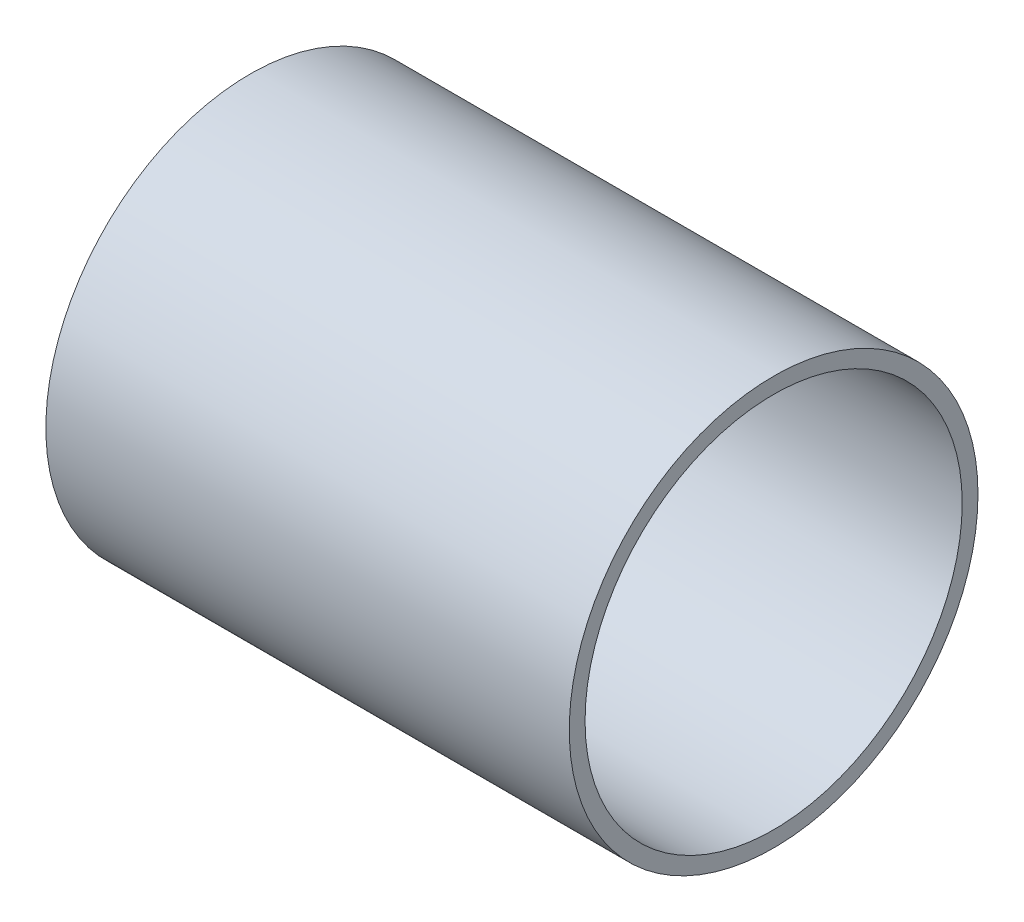
ISO-10303-21;
HEADER;
FILE_DESCRIPTION(('STEP AP214'),'2;1');
FILE_NAME('part.step','',(''),(''),'','','');
FILE_SCHEMA(('AUTOMOTIVE_DESIGN { 1 0 10303 214 1 1 1 1 }'));
ENDSEC;
DATA;
#1=APPLICATION_CONTEXT('core data for automotive mechanical design processes');
#2=APPLICATION_PROTOCOL_DEFINITION('international standard','automotive_design',2000,#1);
#3=PRODUCT_CONTEXT('',#1,'mechanical');
#4=PRODUCT('Part','Part','',(#3));
#5=PRODUCT_RELATED_PRODUCT_CATEGORY('part','',(#4));
#6=PRODUCT_DEFINITION_FORMATION('','',#4);
#7=PRODUCT_DEFINITION_CONTEXT('part definition',#1,'design');
#8=PRODUCT_DEFINITION('design','',#6,#7);
#9=PRODUCT_DEFINITION_SHAPE('','',#8);
#10=(LENGTH_UNIT() NAMED_UNIT(*) SI_UNIT(.MILLI.,.METRE.));
#11=(NAMED_UNIT(*) PLANE_ANGLE_UNIT() SI_UNIT($,.RADIAN.));
#12=(NAMED_UNIT(*) SI_UNIT($,.STERADIAN.) SOLID_ANGLE_UNIT());
#13=UNCERTAINTY_MEASURE_WITH_UNIT(LENGTH_MEASURE(1.E-05),#10,'distance_accuracy_value','');
#14=(GEOMETRIC_REPRESENTATION_CONTEXT(3) GLOBAL_UNCERTAINTY_ASSIGNED_CONTEXT((#13)) GLOBAL_UNIT_ASSIGNED_CONTEXT((#10,
#11,#12)) REPRESENTATION_CONTEXT('',''));
#15=CARTESIAN_POINT('',(0.,0.,0.));
#16=DIRECTION('',(0.,0.,1.));
#17=DIRECTION('',(1.,0.,0.));
#18=AXIS2_PLACEMENT_3D('',#15,#16,#17);
#19=CARTESIAN_POINT('',(110.744,0.,0.));
#20=DIRECTION('',(-1.,0.,0.));
#21=DIRECTION('',(0.,0.,1.));
#22=AXIS2_PLACEMENT_3D('',#19,#20,#21);
#23=CYLINDRICAL_SURFACE('',#22,43.2405959797298);
#24=CARTESIAN_POINT('',(110.744,0.,0.));
#25=DIRECTION('',(1.,0.,0.));
#26=DIRECTION('',(0.,0.,-1.));
#27=AXIS2_PLACEMENT_3D('',#24,#25,#26);
#28=CIRCLE('',#27,43.2405959797298);
#29=CARTESIAN_POINT('',(110.744,0.,-43.2405959797298));
#30=VERTEX_POINT('',#29);
#31=EDGE_CURVE('E10',#30,#30,#28,.T.);
#32=ORIENTED_EDGE('',*,*,#31,.F.);
#33=EDGE_LOOP('',(#32));
#34=FACE_BOUND('',#33,.T.);
#35=CARTESIAN_POINT('',(0.,0.,0.));
#36=DIRECTION('',(1.,0.,0.));
#37=DIRECTION('',(0.,0.,-1.));
#38=AXIS2_PLACEMENT_3D('',#35,#36,#37);
#39=CIRCLE('',#38,43.2405959797298);
#40=CARTESIAN_POINT('',(0.,0.,-43.2405959797298));
#41=VERTEX_POINT('',#40);
#42=EDGE_CURVE('E38',#41,#41,#39,.T.);
#43=ORIENTED_EDGE('',*,*,#42,.T.);
#44=EDGE_LOOP('',(#43));
#45=FACE_BOUND('',#44,.T.);
#46=ADVANCED_FACE('F35',(#34,#45),#23,.T.);
#47=CARTESIAN_POINT('',(110.744,0.,0.));
#48=DIRECTION('',(1.,0.,0.));
#49=DIRECTION('',(0.,0.,-1.));
#50=AXIS2_PLACEMENT_3D('',#47,#48,#49);
#51=PLANE('',#50);
#52=CARTESIAN_POINT('',(110.744,0.,0.));
#53=DIRECTION('',(1.,0.,0.));
#54=DIRECTION('',(0.,0.,-1.));
#55=AXIS2_PLACEMENT_3D('',#52,#53,#54);
#56=CIRCLE('',#55,39.8977803906295);
#57=CARTESIAN_POINT('',(110.744,0.,-39.8977803906295));
#58=VERTEX_POINT('',#57);
#59=EDGE_CURVE('E47',#58,#58,#56,.T.);
#60=ORIENTED_EDGE('',*,*,#59,.F.);
#61=EDGE_LOOP('',(#60));
#62=FACE_BOUND('',#61,.T.);
#63=ORIENTED_EDGE('',*,*,#31,.T.);
#64=EDGE_LOOP('',(#63));
#65=FACE_BOUND('',#64,.T.);
#66=ADVANCED_FACE('F62',(#62,#65),#51,.T.);
#67=CARTESIAN_POINT('',(0.,0.,0.));
#68=DIRECTION('',(1.,0.,0.));
#69=DIRECTION('',(0.,0.,-1.));
#70=AXIS2_PLACEMENT_3D('',#67,#68,#69);
#71=PLANE('',#70);
#72=CARTESIAN_POINT('',(0.,0.,0.));
#73=DIRECTION('',(1.,0.,0.));
#74=DIRECTION('',(0.,0.,-1.));
#75=AXIS2_PLACEMENT_3D('',#72,#73,#74);
#76=CIRCLE('',#75,39.8977803906295);
#77=CARTESIAN_POINT('',(0.,0.,-39.8977803906295));
#78=VERTEX_POINT('',#77);
#79=EDGE_CURVE('E45',#78,#78,#76,.T.);
#80=ORIENTED_EDGE('',*,*,#79,.T.);
#81=EDGE_LOOP('',(#80));
#82=FACE_BOUND('',#81,.T.);
#83=ORIENTED_EDGE('',*,*,#42,.F.);
#84=EDGE_LOOP('',(#83));
#85=FACE_BOUND('',#84,.T.);
#86=ADVANCED_FACE('F53',(#82,#85),#71,.F.);
#87=CARTESIAN_POINT('',(0.,0.,0.));
#88=DIRECTION('',(1.,0.,0.));
#89=DIRECTION('',(0.,0.,-1.));
#90=AXIS2_PLACEMENT_3D('',#87,#88,#89);
#91=CYLINDRICAL_SURFACE('',#90,39.8977803906295);
#92=ORIENTED_EDGE('',*,*,#79,.F.);
#93=EDGE_LOOP('',(#92));
#94=FACE_BOUND('',#93,.T.);
#95=ORIENTED_EDGE('',*,*,#59,.T.);
#96=EDGE_LOOP('',(#95));
#97=FACE_BOUND('',#96,.T.);
#98=ADVANCED_FACE('F56',(#94,#97),#91,.F.);
#99=CLOSED_SHELL('',(#46,#66,#86,#98));
#100=MANIFOLD_SOLID_BREP('B2',#99);
#101=ADVANCED_BREP_SHAPE_REPRESENTATION('',(#18,#100),#14);
#102=SHAPE_DEFINITION_REPRESENTATION(#9,#101);
ENDSEC;
END-ISO-10303-21;
